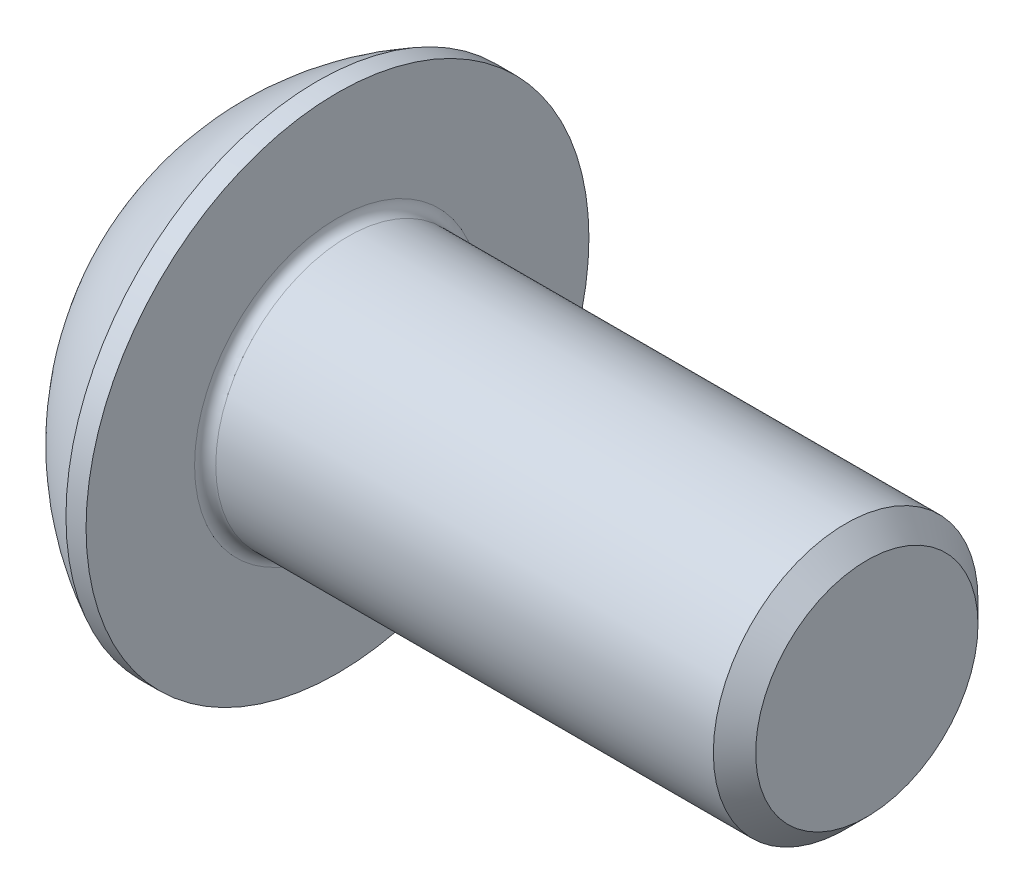
ISO-10303-21;
HEADER;
FILE_DESCRIPTION(('STEP AP214'),'2;1');
FILE_NAME('part.step','',(''),(''),'','','');
FILE_SCHEMA(('AUTOMOTIVE_DESIGN { 1 0 10303 214 1 1 1 1 }'));
ENDSEC;
DATA;
#1=APPLICATION_CONTEXT('core data for automotive mechanical design processes');
#2=APPLICATION_PROTOCOL_DEFINITION('international standard','automotive_design',2000,#1);
#3=PRODUCT_CONTEXT('',#1,'mechanical');
#4=PRODUCT('Part','Part','',(#3));
#5=PRODUCT_RELATED_PRODUCT_CATEGORY('part','',(#4));
#6=PRODUCT_DEFINITION_FORMATION('','',#4);
#7=PRODUCT_DEFINITION_CONTEXT('part definition',#1,'design');
#8=PRODUCT_DEFINITION('design','',#6,#7);
#9=PRODUCT_DEFINITION_SHAPE('','',#8);
#10=(LENGTH_UNIT() NAMED_UNIT(*) SI_UNIT(.MILLI.,.METRE.));
#11=(NAMED_UNIT(*) PLANE_ANGLE_UNIT() SI_UNIT($,.RADIAN.));
#12=(NAMED_UNIT(*) SI_UNIT($,.STERADIAN.) SOLID_ANGLE_UNIT());
#13=UNCERTAINTY_MEASURE_WITH_UNIT(LENGTH_MEASURE(1.E-05),#10,'distance_accuracy_value','');
#14=(GEOMETRIC_REPRESENTATION_CONTEXT(3) GLOBAL_UNCERTAINTY_ASSIGNED_CONTEXT((#13)) GLOBAL_UNIT_ASSIGNED_CONTEXT((#10,
#11,#12)) REPRESENTATION_CONTEXT('',''));
#15=CARTESIAN_POINT('',(0.,0.,0.));
#16=DIRECTION('',(0.,0.,1.));
#17=DIRECTION('',(1.,0.,0.));
#18=AXIS2_PLACEMENT_3D('',#15,#16,#17);
#19=CARTESIAN_POINT('',(0.,0.,0.));
#20=DIRECTION('',(-1.,0.,0.));
#21=DIRECTION('',(0.,0.,1.));
#22=AXIS2_PLACEMENT_3D('',#19,#20,#21);
#23=PLANE('',#22);
#24=CARTESIAN_POINT('',(0.,0.,0.));
#25=DIRECTION('',(-1.,0.,0.));
#26=DIRECTION('',(0.,0.,1.));
#27=AXIS2_PLACEMENT_3D('',#24,#25,#26);
#28=CIRCLE('',#27,2.375);
#29=CARTESIAN_POINT('',(0.,2.375,0.));
#30=VERTEX_POINT('',#29);
#31=EDGE_CURVE('E164',#30,#30,#28,.T.);
#32=ORIENTED_EDGE('',*,*,#31,.T.);
#33=EDGE_LOOP('',(#32));
#34=FACE_BOUND('',#33,.T.);
#35=DIRECTION('',(0.,-1.,0.));
#36=VECTOR('',#35,1.);
#37=CARTESIAN_POINT('',(0.,-0.866025403784443,1.49999999999995));
#38=LINE('',#37,#36);
#39=CARTESIAN_POINT('',(0.,0.866025403784443,1.49999999999995));
#40=VERTEX_POINT('',#39);
#41=CARTESIAN_POINT('',(0.,-0.866025403784443,1.49999999999995));
#42=VERTEX_POINT('',#41);
#43=EDGE_CURVE('E65',#40,#42,#38,.T.);
#44=ORIENTED_EDGE('',*,*,#43,.T.);
#45=DIRECTION('',(0.,-0.500000000000002,-0.866025403784442));
#46=VECTOR('',#45,1.);
#47=CARTESIAN_POINT('',(0.,-1.73205080756889,0.));
#48=LINE('',#47,#46);
#49=CARTESIAN_POINT('',(0.,-1.73205080756889,0.));
#50=VERTEX_POINT('',#49);
#51=EDGE_CURVE('E305',#42,#50,#48,.T.);
#52=ORIENTED_EDGE('',*,*,#51,.T.);
#53=DIRECTION('',(0.,0.500000000000002,-0.866025403784442));
#54=VECTOR('',#53,1.);
#55=CARTESIAN_POINT('',(0.,-0.866025403784443,-1.49999999999995));
#56=LINE('',#55,#54);
#57=CARTESIAN_POINT('',(0.,-0.866025403784443,-1.49999999999995));
#58=VERTEX_POINT('',#57);
#59=EDGE_CURVE('E145',#50,#58,#56,.T.);
#60=ORIENTED_EDGE('',*,*,#59,.T.);
#61=DIRECTION('',(0.,1.,0.));
#62=VECTOR('',#61,1.);
#63=CARTESIAN_POINT('',(0.,0.866025403784443,-1.49999999999995));
#64=LINE('',#63,#62);
#65=CARTESIAN_POINT('',(0.,0.866025403784443,-1.49999999999995));
#66=VERTEX_POINT('',#65);
#67=EDGE_CURVE('E308',#58,#66,#64,.T.);
#68=ORIENTED_EDGE('',*,*,#67,.T.);
#69=DIRECTION('',(0.,0.500000000000002,0.866025403784442));
#70=VECTOR('',#69,1.);
#71=CARTESIAN_POINT('',(0.,1.73205080756889,0.));
#72=LINE('',#71,#70);
#73=CARTESIAN_POINT('',(0.,1.73205080756889,0.));
#74=VERTEX_POINT('',#73);
#75=EDGE_CURVE('E310',#66,#74,#72,.T.);
#76=ORIENTED_EDGE('',*,*,#75,.T.);
#77=DIRECTION('',(0.,-0.500000000000002,0.866025403784442));
#78=VECTOR('',#77,1.);
#79=CARTESIAN_POINT('',(0.,0.866025403784443,1.49999999999995));
#80=LINE('',#79,#78);
#81=EDGE_CURVE('E312',#74,#40,#80,.T.);
#82=ORIENTED_EDGE('',*,*,#81,.T.);
#83=EDGE_LOOP('',(#44,#52,#60,#68,#76,#82));
#84=FACE_BOUND('',#83,.T.);
#85=ADVANCED_FACE('F49',(#34,#84),#23,.T.);
#86=CARTESIAN_POINT('',(4.75501582278481,0.,0.));
#87=DIRECTION('',(-1.,0.,0.));
#88=DIRECTION('',(0.,1.,0.));
#89=AXIS2_PLACEMENT_3D('',#86,#87,#88);
#90=SPHERICAL_SURFACE('',#89,5.31514820818139);
#91=CARTESIAN_POINT('',(2.37,0.,0.));
#92=DIRECTION('',(-1.,0.,0.));
#93=DIRECTION('',(0.,0.,1.));
#94=AXIS2_PLACEMENT_3D('',#91,#92,#93);
#95=CIRCLE('',#94,4.75);
#96=CARTESIAN_POINT('',(2.37,4.75000000000001,0.));
#97=VERTEX_POINT('',#96);
#98=EDGE_CURVE('E161',#97,#97,#95,.T.);
#99=CARTESIAN_POINT('',(2.37,4.75000000000001,0.));
#100=CARTESIAN_POINT('',(2.33822259048669,4.73404434732512,0.));
#101=CARTESIAN_POINT('',(2.30660534291523,4.71776971995818,0.));
#102=CARTESIAN_POINT('',(2.24370380094997,4.6845892715834,0.));
#103=CARTESIAN_POINT('',(2.21241950655618,4.66768345057555,0.));
#104=CARTESIAN_POINT('',(2.15019650024021,4.63324737066211,0.));
#105=CARTESIAN_POINT('',(2.11925778831804,4.61571711175651,0.));
#106=CARTESIAN_POINT('',(2.05773840110808,4.58003923142986,0.));
#107=CARTESIAN_POINT('',(2.02715772582028,4.5618916100088,0.));
#108=CARTESIAN_POINT('',(1.96636673145741,4.52498631044658,0.));
#109=CARTESIAN_POINT('',(1.93615641238234,4.50622863230543,0.));
#110=CARTESIAN_POINT('',(1.87611829826807,4.46811077571319,0.));
#111=CARTESIAN_POINT('',(1.84629050322888,4.44875059726211,0.));
#112=CARTESIAN_POINT('',(1.78702945162455,4.40943553782985,0.));
#113=CARTESIAN_POINT('',(1.75759619505941,4.38948065684866,0.));
#114=CARTESIAN_POINT('',(1.69913607574061,4.34898423002649,0.));
#115=CARTESIAN_POINT('',(1.67010921298694,4.32844268418549,0.));
#116=CARTESIAN_POINT('',(1.61247357298735,4.28678120152176,0.));
#117=CARTESIAN_POINT('',(1.58386479574143,4.26566126469901,0.));
#118=CARTESIAN_POINT('',(1.52707685004032,4.22285150694425,0.));
#119=CARTESIAN_POINT('',(1.49889768158512,4.20116168601224,0.));
#120=CARTESIAN_POINT('',(1.44298030371049,4.15722089644742,0.));
#121=CARTESIAN_POINT('',(1.41524209429107,4.13496992781462,0.));
#122=CARTESIAN_POINT('',(1.36021780711889,4.08991580528236,0.));
#123=CARTESIAN_POINT('',(1.33293172936613,4.06711265138289,0.));
#124=CARTESIAN_POINT('',(1.278822696045,4.02096334316478,0.));
#125=CARTESIAN_POINT('',(1.25199974047662,3.99761718884615,0.));
#126=CARTESIAN_POINT('',(1.19882775550162,3.95039128335164,0.));
#127=CARTESIAN_POINT('',(1.172478726095,3.92651153217577,0.));
#128=CARTESIAN_POINT('',(1.1202652065289,3.87822805145536,0.));
#129=CARTESIAN_POINT('',(1.09440071636942,3.85382432191082,0.));
#130=CARTESIAN_POINT('',(1.04316669321617,3.8045027139941,0.));
#131=CARTESIAN_POINT('',(1.01779716022241,3.77958483562193,0.));
#132=CARTESIAN_POINT('',(0.9675632699561,3.72924496668417,0.));
#133=CARTESIAN_POINT('',(0.942698912683562,3.70382297611859,0.));
#134=CARTESIAN_POINT('',(0.89348538893628,3.65248512247887,0.));
#135=CARTESIAN_POINT('',(0.869136222461535,3.62656925940473,0.));
#136=CARTESIAN_POINT('',(0.820962887873489,3.57425409935885,0.));
#137=CARTESIAN_POINT('',(0.797138719760188,3.54785480238712,0.));
#138=CARTESIAN_POINT('',(0.750024977995378,3.49458340787865,0.));
#139=CARTESIAN_POINT('',(0.726735404343869,3.46771131034192,0.));
#140=CARTESIAN_POINT('',(0.680700232274541,3.41350513847464,0.));
#141=CARTESIAN_POINT('',(0.657954633856721,3.3861710641441,0.));
#142=CARTESIAN_POINT('',(0.613016573919583,3.33105194853939,0.));
#143=CARTESIAN_POINT('',(0.590824112400264,3.30326690726522,0.));
#144=CARTESIAN_POINT('',(0.547001265128255,3.24725704926749,0.));
#145=CARTESIAN_POINT('',(0.525370879375565,3.21903223254391,0.));
#146=CARTESIAN_POINT('',(0.48268089610549,3.16215419227902,0.));
#147=CARTESIAN_POINT('',(0.461621298588105,3.1335009687377,0.));
#148=CARTESIAN_POINT('',(0.420081374357154,3.07577765602273,0.));
#149=CARTESIAN_POINT('',(0.399601047643588,3.04670756684908,0.));
#150=CARTESIAN_POINT('',(0.359227914239948,2.98816223197683,0.));
#151=CARTESIAN_POINT('',(0.339335107549872,2.95868698627822,0.));
#152=CARTESIAN_POINT('',(0.300145026860787,2.89934321060632,0.));
#153=CARTESIAN_POINT('',(0.280847752861776,2.86947468063304,0.));
#154=CARTESIAN_POINT('',(0.24285650999714,2.80935636725696,0.));
#155=CARTESIAN_POINT('',(0.224162541131515,2.77910658385417,0.));
#156=CARTESIAN_POINT('',(0.187385439283607,2.71823794734018,0.));
#157=CARTESIAN_POINT('',(0.169302306301325,2.68761909422898,0.));
#158=CARTESIAN_POINT('',(0.133754156035989,2.626024653246,0.));
#159=CARTESIAN_POINT('',(0.116289138752934,2.59504906537422,0.));
#160=CARTESIAN_POINT('',(0.0819842690057421,2.53275362391635,0.));
#161=CARTESIAN_POINT('',(0.0651444165416046,2.50143377033028,0.));
#162=CARTESIAN_POINT('',(0.0320966055444313,2.43846244094735,0.));
#163=CARTESIAN_POINT('',(0.0158886470113954,2.40681096515049,0.));
#164=CARTESIAN_POINT('',(0.,2.375,0.));
#165=B_SPLINE_CURVE_WITH_KNOTS('',3,(#99,#100,#101,#102,#103,#104,#105,#106,#107,#108,#109,#110,
#111,#112,#113,#114,#115,#116,#117,#118,#119,#120,#121,#122,#123,#124,#125,#126,#127,#128,#129,
#130,#131,#132,#133,#134,#135,#136,#137,#138,#139,#140,#141,#142,#143,#144,#145,#146,#147,#148,
#149,#150,#151,#152,#153,#154,#155,#156,#157,#158,#159,#160,#161,#162,#163,#164),.UNSPECIFIED.,
.F.,.F.,(4,2,2,2,2,2,2,2,2,2,2,2,2,2,2,2,2,2,2,2,2,2,2,2,2,2,2,2,2,2,2,2,4),(0.,
0.106672849678272,0.213345699356545,0.320018549034818,0.42669139871309,0.533364248391363,
0.640037098069635,0.746709947747908,0.853382797426182,0.960055647104454,1.06672849678273,
1.173401346461,1.28007419613927,1.38674704581754,1.49341989549582,1.60009274517409,
1.70676559485236,1.81343844453064,1.92011129420891,2.02678414388718,2.13345699356545,
2.24012984324373,2.346802692922,2.45347554260027,2.56014839227854,2.66682124195682,
2.77349409163509,2.88016694131336,2.98683979099164,3.09351264066991,3.20018549034818,
3.30685834002646,3.41353118970473),.UNSPECIFIED.);
#166=EDGE_CURVE('BSEAM186',#97,#30,#165,.T.);
#167=ORIENTED_EDGE('',*,*,#98,.T.);
#168=ORIENTED_EDGE('',*,*,#31,.F.);
#169=ORIENTED_EDGE('',*,*,#166,.T.);
#170=ORIENTED_EDGE('',*,*,#166,.F.);
#171=EDGE_LOOP('',(#167,#169,#168,#170));
#172=FACE_BOUND('',#171,.T.);
#173=ADVANCED_FACE('F186',(#172),#90,.T.);
#174=CARTESIAN_POINT('',(0.,0.,0.));
#175=DIRECTION('',(-1.,0.,0.));
#176=DIRECTION('',(0.,0.,1.));
#177=AXIS2_PLACEMENT_3D('',#174,#175,#176);
#178=CYLINDRICAL_SURFACE('',#177,4.75);
#179=ORIENTED_EDGE('',*,*,#98,.F.);
#180=EDGE_LOOP('',(#179));
#181=FACE_BOUND('',#180,.T.);
#182=CARTESIAN_POINT('',(2.75,0.,0.));
#183=DIRECTION('',(-1.,0.,0.));
#184=DIRECTION('',(0.,0.,1.));
#185=AXIS2_PLACEMENT_3D('',#182,#183,#184);
#186=CIRCLE('',#185,4.75);
#187=CARTESIAN_POINT('',(2.75,0.,4.75000000000002));
#188=VERTEX_POINT('',#187);
#189=EDGE_CURVE('E157',#188,#188,#186,.T.);
#190=ORIENTED_EDGE('',*,*,#189,.T.);
#191=EDGE_LOOP('',(#190));
#192=FACE_BOUND('',#191,.T.);
#193=ADVANCED_FACE('F194',(#181,#192),#178,.T.);
#194=CARTESIAN_POINT('',(2.75,2.5,0.));
#195=DIRECTION('',(-1.,0.,0.));
#196=DIRECTION('',(0.,0.,1.));
#197=AXIS2_PLACEMENT_3D('',#194,#195,#196);
#198=PLANE('',#197);
#199=CARTESIAN_POINT('',(2.75,0.,0.));
#200=DIRECTION('',(-1.,0.,0.));
#201=DIRECTION('',(0.,0.,1.));
#202=AXIS2_PLACEMENT_3D('',#199,#200,#201);
#203=CIRCLE('',#202,2.7);
#204=CARTESIAN_POINT('',(2.75,0.,2.70000000000001));
#205=VERTEX_POINT('',#204);
#206=EDGE_CURVE('E167',#205,#205,#203,.T.);
#207=ORIENTED_EDGE('',*,*,#206,.T.);
#208=EDGE_LOOP('',(#207));
#209=FACE_BOUND('',#208,.T.);
#210=ORIENTED_EDGE('',*,*,#189,.F.);
#211=EDGE_LOOP('',(#210));
#212=FACE_BOUND('',#211,.T.);
#213=ADVANCED_FACE('F207',(#209,#212),#198,.F.);
#214=CARTESIAN_POINT('',(0.,0.,0.));
#215=DIRECTION('',(-1.,0.,0.));
#216=DIRECTION('',(0.,0.,1.));
#217=AXIS2_PLACEMENT_3D('',#214,#215,#216);
#218=CYLINDRICAL_SURFACE('',#217,2.5);
#219=CARTESIAN_POINT('',(12.35,0.,0.));
#220=DIRECTION('',(1.,0.,0.));
#221=DIRECTION('',(0.,0.,-1.));
#222=AXIS2_PLACEMENT_3D('',#219,#220,#221);
#223=CIRCLE('',#222,2.5);
#224=CARTESIAN_POINT('',(12.35,0.,-2.5));
#225=VERTEX_POINT('',#224);
#226=EDGE_CURVE('E13',#225,#225,#223,.F.);
#227=ORIENTED_EDGE('',*,*,#226,.T.);
#228=EDGE_LOOP('',(#227));
#229=FACE_BOUND('',#228,.T.);
#230=CARTESIAN_POINT('',(2.95,0.,0.));
#231=DIRECTION('',(-1.,0.,0.));
#232=DIRECTION('',(0.,0.,1.));
#233=AXIS2_PLACEMENT_3D('',#230,#231,#232);
#234=CIRCLE('',#233,2.5);
#235=CARTESIAN_POINT('',(2.95,0.,2.50000000000001));
#236=VERTEX_POINT('',#235);
#237=EDGE_CURVE('E170',#236,#236,#234,.F.);
#238=ORIENTED_EDGE('',*,*,#237,.T.);
#239=EDGE_LOOP('',(#238));
#240=FACE_BOUND('',#239,.T.);
#241=ADVANCED_FACE('F200',(#229,#240),#218,.T.);
#242=CARTESIAN_POINT('',(2.95,0.,0.));
#243=DIRECTION('',(-1.,0.,0.));
#244=DIRECTION('',(0.,0.,1.));
#245=AXIS2_PLACEMENT_3D('',#242,#243,#244);
#246=TOROIDAL_SURFACE('',#245,2.7,0.2);
#247=ORIENTED_EDGE('',*,*,#237,.F.);
#248=EDGE_LOOP('',(#247));
#249=FACE_BOUND('',#248,.T.);
#250=ORIENTED_EDGE('',*,*,#206,.F.);
#251=EDGE_LOOP('',(#250));
#252=FACE_BOUND('',#251,.T.);
#253=ADVANCED_FACE('F198',(#249,#252),#246,.F.);
#254=CARTESIAN_POINT('',(1.56,-1.73205080756889,0.));
#255=DIRECTION('',(0.,0.866025403784442,-0.500000000000002));
#256=DIRECTION('',(0.,0.500000000000002,0.866025403784442));
#257=AXIS2_PLACEMENT_3D('',#254,#255,#256);
#258=PLANE('',#257);
#259=DIRECTION('',(0.,-0.500000000000002,-0.866025403784442));
#260=VECTOR('',#259,1.);
#261=CARTESIAN_POINT('',(1.56,-1.73205080756889,0.));
#262=LINE('',#261,#260);
#263=CARTESIAN_POINT('',(1.56,-0.866025403784443,1.49999999999995));
#264=VERTEX_POINT('',#263);
#265=CARTESIAN_POINT('',(1.56,-1.29903810567666,0.750000000000028));
#266=VERTEX_POINT('',#265);
#267=EDGE_CURVE('E131',#264,#266,#262,.T.);
#268=ORIENTED_EDGE('',*,*,#267,.T.);
#269=CARTESIAN_POINT('',(1.56,-1.73205080756889,0.));
#270=VERTEX_POINT('',#269);
#271=EDGE_CURVE('E126',#266,#270,#262,.T.);
#272=ORIENTED_EDGE('',*,*,#271,.T.);
#273=DIRECTION('',(-1.,0.,0.));
#274=VECTOR('',#273,1.);
#275=CARTESIAN_POINT('',(1.56,-1.73205080756889,0.));
#276=LINE('',#275,#274);
#277=EDGE_CURVE('E128',#270,#50,#276,.T.);
#278=ORIENTED_EDGE('',*,*,#277,.T.);
#279=ORIENTED_EDGE('',*,*,#51,.F.);
#280=DIRECTION('',(-1.,0.,0.));
#281=VECTOR('',#280,1.);
#282=CARTESIAN_POINT('',(1.56,-0.866025403784443,1.49999999999995));
#283=LINE('',#282,#281);
#284=EDGE_CURVE('E301',#264,#42,#283,.T.);
#285=ORIENTED_EDGE('',*,*,#284,.F.);
#286=EDGE_LOOP('',(#268,#272,#278,#279,#285));
#287=FACE_BOUND('',#286,.T.);
#288=ADVANCED_FACE('F127',(#287),#258,.T.);
#289=CARTESIAN_POINT('',(1.56,-0.866025403784443,-1.49999999999995));
#290=DIRECTION('',(0.,0.866025403784442,0.500000000000002));
#291=DIRECTION('',(0.,-0.500000000000002,0.866025403784442));
#292=AXIS2_PLACEMENT_3D('',#289,#290,#291);
#293=PLANE('',#292);
#294=DIRECTION('',(0.,0.500000000000002,-0.866025403784442));
#295=VECTOR('',#294,1.);
#296=CARTESIAN_POINT('',(1.56,-0.866025403784443,-1.49999999999995));
#297=LINE('',#296,#295);
#298=CARTESIAN_POINT('',(1.56,-1.29903810567666,-0.750000000000028));
#299=VERTEX_POINT('',#298);
#300=EDGE_CURVE('E73',#270,#299,#297,.T.);
#301=ORIENTED_EDGE('',*,*,#300,.T.);
#302=CARTESIAN_POINT('',(1.56,-0.866025403784443,-1.49999999999995));
#303=VERTEX_POINT('',#302);
#304=EDGE_CURVE('E140',#299,#303,#297,.T.);
#305=ORIENTED_EDGE('',*,*,#304,.T.);
#306=DIRECTION('',(-1.,0.,0.));
#307=VECTOR('',#306,1.);
#308=CARTESIAN_POINT('',(1.56,-0.866025403784443,-1.49999999999995));
#309=LINE('',#308,#307);
#310=EDGE_CURVE('E147',#303,#58,#309,.T.);
#311=ORIENTED_EDGE('',*,*,#310,.T.);
#312=ORIENTED_EDGE('',*,*,#59,.F.);
#313=ORIENTED_EDGE('',*,*,#277,.F.);
#314=EDGE_LOOP('',(#301,#305,#311,#312,#313));
#315=FACE_BOUND('',#314,.T.);
#316=ADVANCED_FACE('F143',(#315),#293,.T.);
#317=CARTESIAN_POINT('',(1.56,0.866025403784443,-1.49999999999995));
#318=DIRECTION('',(0.,0.,1.));
#319=DIRECTION('',(1.,0.,0.));
#320=AXIS2_PLACEMENT_3D('',#317,#318,#319);
#321=PLANE('',#320);
#322=DIRECTION('',(0.,1.,0.));
#323=VECTOR('',#322,1.);
#324=CARTESIAN_POINT('',(1.56,0.866025403784443,-1.49999999999995));
#325=LINE('',#324,#323);
#326=CARTESIAN_POINT('',(1.56,0.,-1.49999999999995));
#327=VERTEX_POINT('',#326);
#328=EDGE_CURVE('E282',#303,#327,#325,.T.);
#329=ORIENTED_EDGE('',*,*,#328,.T.);
#330=CARTESIAN_POINT('',(1.56,0.866025403784443,-1.49999999999995));
#331=VERTEX_POINT('',#330);
#332=EDGE_CURVE('E139',#327,#331,#325,.T.);
#333=ORIENTED_EDGE('',*,*,#332,.T.);
#334=DIRECTION('',(-1.,0.,0.));
#335=VECTOR('',#334,1.);
#336=CARTESIAN_POINT('',(1.56,0.866025403784443,-1.49999999999995));
#337=LINE('',#336,#335);
#338=EDGE_CURVE('E152',#331,#66,#337,.T.);
#339=ORIENTED_EDGE('',*,*,#338,.T.);
#340=ORIENTED_EDGE('',*,*,#67,.F.);
#341=ORIENTED_EDGE('',*,*,#310,.F.);
#342=EDGE_LOOP('',(#329,#333,#339,#340,#341));
#343=FACE_BOUND('',#342,.T.);
#344=ADVANCED_FACE('F232',(#343),#321,.T.);
#345=CARTESIAN_POINT('',(1.56,1.73205080756889,0.));
#346=DIRECTION('',(0.,-0.866025403784442,0.500000000000002));
#347=DIRECTION('',(0.,-0.500000000000002,-0.866025403784442));
#348=AXIS2_PLACEMENT_3D('',#345,#346,#347);
#349=PLANE('',#348);
#350=DIRECTION('',(0.,0.500000000000002,0.866025403784442));
#351=VECTOR('',#350,1.);
#352=CARTESIAN_POINT('',(1.56,1.73205080756889,0.));
#353=LINE('',#352,#351);
#354=CARTESIAN_POINT('',(1.56,1.29903810567666,-0.750000000000028));
#355=VERTEX_POINT('',#354);
#356=EDGE_CURVE('E271',#331,#355,#353,.T.);
#357=ORIENTED_EDGE('',*,*,#356,.T.);
#358=CARTESIAN_POINT('',(1.56,1.73205080756889,0.));
#359=VERTEX_POINT('',#358);
#360=EDGE_CURVE('E276',#355,#359,#353,.T.);
#361=ORIENTED_EDGE('',*,*,#360,.T.);
#362=DIRECTION('',(-1.,0.,0.));
#363=VECTOR('',#362,1.);
#364=CARTESIAN_POINT('',(1.56,1.73205080756889,0.));
#365=LINE('',#364,#363);
#366=EDGE_CURVE('E316',#359,#74,#365,.T.);
#367=ORIENTED_EDGE('',*,*,#366,.T.);
#368=ORIENTED_EDGE('',*,*,#75,.F.);
#369=ORIENTED_EDGE('',*,*,#338,.F.);
#370=EDGE_LOOP('',(#357,#361,#367,#368,#369));
#371=FACE_BOUND('',#370,.T.);
#372=ADVANCED_FACE('F235',(#371),#349,.T.);
#373=CARTESIAN_POINT('',(1.56,0.866025403784443,1.49999999999995));
#374=DIRECTION('',(0.,-0.866025403784442,-0.500000000000002));
#375=DIRECTION('',(0.,0.500000000000002,-0.866025403784442));
#376=AXIS2_PLACEMENT_3D('',#373,#374,#375);
#377=PLANE('',#376);
#378=DIRECTION('',(0.,-0.500000000000002,0.866025403784442));
#379=VECTOR('',#378,1.);
#380=CARTESIAN_POINT('',(1.56,0.866025403784443,1.49999999999995));
#381=LINE('',#380,#379);
#382=CARTESIAN_POINT('',(1.56,1.29903810567666,0.750000000000028));
#383=VERTEX_POINT('',#382);
#384=EDGE_CURVE('E279',#359,#383,#381,.T.);
#385=ORIENTED_EDGE('',*,*,#384,.T.);
#386=CARTESIAN_POINT('',(1.56,0.866025403784443,1.49999999999995));
#387=VERTEX_POINT('',#386);
#388=EDGE_CURVE('E287',#383,#387,#381,.T.);
#389=ORIENTED_EDGE('',*,*,#388,.T.);
#390=DIRECTION('',(-1.,0.,0.));
#391=VECTOR('',#390,1.);
#392=CARTESIAN_POINT('',(1.56,0.866025403784443,1.49999999999995));
#393=LINE('',#392,#391);
#394=EDGE_CURVE('E300',#387,#40,#393,.T.);
#395=ORIENTED_EDGE('',*,*,#394,.T.);
#396=ORIENTED_EDGE('',*,*,#81,.F.);
#397=ORIENTED_EDGE('',*,*,#366,.F.);
#398=EDGE_LOOP('',(#385,#389,#395,#396,#397));
#399=FACE_BOUND('',#398,.T.);
#400=ADVANCED_FACE('F239',(#399),#377,.T.);
#401=CARTESIAN_POINT('',(1.56,-0.866025403784443,1.49999999999995));
#402=DIRECTION('',(0.,0.,-1.));
#403=DIRECTION('',(-1.,0.,0.));
#404=AXIS2_PLACEMENT_3D('',#401,#402,#403);
#405=PLANE('',#404);
#406=DIRECTION('',(0.,-1.,0.));
#407=VECTOR('',#406,1.);
#408=CARTESIAN_POINT('',(1.56,-0.866025403784443,1.49999999999995));
#409=LINE('',#408,#407);
#410=CARTESIAN_POINT('',(1.56,0.,1.49999999999995));
#411=VERTEX_POINT('',#410);
#412=EDGE_CURVE('E293',#387,#411,#409,.T.);
#413=ORIENTED_EDGE('',*,*,#412,.T.);
#414=EDGE_CURVE('E295',#411,#264,#409,.T.);
#415=ORIENTED_EDGE('',*,*,#414,.T.);
#416=ORIENTED_EDGE('',*,*,#284,.T.);
#417=ORIENTED_EDGE('',*,*,#43,.F.);
#418=ORIENTED_EDGE('',*,*,#394,.F.);
#419=EDGE_LOOP('',(#413,#415,#416,#417,#418));
#420=FACE_BOUND('',#419,.T.);
#421=ADVANCED_FACE('F243',(#420),#405,.T.);
#422=CARTESIAN_POINT('',(1.56,-1.73205080756889,0.));
#423=DIRECTION('',(1.,0.,0.));
#424=DIRECTION('',(0.,0.,-1.));
#425=AXIS2_PLACEMENT_3D('',#422,#423,#424);
#426=PLANE('',#425);
#427=CARTESIAN_POINT('',(1.56,0.,0.));
#428=DIRECTION('',(-1.,0.,0.));
#429=DIRECTION('',(0.,0.,1.));
#430=AXIS2_PLACEMENT_3D('',#427,#428,#429);
#431=CIRCLE('',#430,1.5);
#432=EDGE_CURVE('E268',#355,#327,#431,.T.);
#433=ORIENTED_EDGE('',*,*,#432,.F.);
#434=ORIENTED_EDGE('',*,*,#356,.F.);
#435=ORIENTED_EDGE('',*,*,#332,.F.);
#436=EDGE_LOOP('',(#433,#434,#435));
#437=FACE_BOUND('',#436,.T.);
#438=ADVANCED_FACE('F247',(#437),#426,.F.);
#439=EDGE_CURVE('E158',#383,#355,#431,.T.);
#440=ORIENTED_EDGE('',*,*,#439,.F.);
#441=ORIENTED_EDGE('',*,*,#384,.F.);
#442=ORIENTED_EDGE('',*,*,#360,.F.);
#443=EDGE_LOOP('',(#440,#441,#442));
#444=FACE_BOUND('',#443,.T.);
#445=ADVANCED_FACE('F257',(#444),#426,.F.);
#446=EDGE_CURVE('E151',#411,#383,#431,.T.);
#447=ORIENTED_EDGE('',*,*,#446,.F.);
#448=ORIENTED_EDGE('',*,*,#412,.F.);
#449=ORIENTED_EDGE('',*,*,#388,.F.);
#450=EDGE_LOOP('',(#447,#448,#449));
#451=FACE_BOUND('',#450,.T.);
#452=ADVANCED_FACE('F263',(#451),#426,.F.);
#453=EDGE_CURVE('E146',#266,#411,#431,.T.);
#454=ORIENTED_EDGE('',*,*,#453,.F.);
#455=ORIENTED_EDGE('',*,*,#267,.F.);
#456=ORIENTED_EDGE('',*,*,#414,.F.);
#457=EDGE_LOOP('',(#454,#455,#456));
#458=FACE_BOUND('',#457,.T.);
#459=ADVANCED_FACE('F255',(#458),#426,.F.);
#460=EDGE_CURVE('E137',#299,#266,#431,.T.);
#461=ORIENTED_EDGE('',*,*,#460,.F.);
#462=ORIENTED_EDGE('',*,*,#300,.F.);
#463=ORIENTED_EDGE('',*,*,#271,.F.);
#464=EDGE_LOOP('',(#461,#462,#463));
#465=FACE_BOUND('',#464,.T.);
#466=ADVANCED_FACE('F136',(#465),#426,.F.);
#467=EDGE_CURVE('E274',#327,#299,#431,.T.);
#468=ORIENTED_EDGE('',*,*,#467,.F.);
#469=ORIENTED_EDGE('',*,*,#328,.F.);
#470=ORIENTED_EDGE('',*,*,#304,.F.);
#471=EDGE_LOOP('',(#468,#469,#470));
#472=FACE_BOUND('',#471,.T.);
#473=ADVANCED_FACE('F227',(#472),#426,.F.);
#474=CARTESIAN_POINT('',(2.42602540378445,0.,0.));
#475=DIRECTION('',(-1.,0.,0.));
#476=DIRECTION('',(0.,0.,1.));
#477=AXIS2_PLACEMENT_3D('',#474,#475,#476);
#478=CONICAL_SURFACE('',#477,0.,1.0471975511966);
#479=ORIENTED_EDGE('',*,*,#446,.T.);
#480=ORIENTED_EDGE('',*,*,#439,.T.);
#481=ORIENTED_EDGE('',*,*,#432,.T.);
#482=ORIENTED_EDGE('',*,*,#467,.T.);
#483=ORIENTED_EDGE('',*,*,#460,.T.);
#484=ORIENTED_EDGE('',*,*,#453,.T.);
#485=EDGE_LOOP('',(#479,#480,#481,#482,#483,#484));
#486=FACE_BOUND('',#485,.T.);
#487=CARTESIAN_POINT('',(2.42602540378445,0.,0.));
#488=VERTEX_POINT('',#487);
#489=VERTEX_LOOP('',#488);
#490=FACE_BOUND('',#489,.T.);
#491=ADVANCED_FACE('F182',(#486,#490),#478,.F.);
#492=CARTESIAN_POINT('',(12.75,0.,0.));
#493=DIRECTION('',(1.,0.,0.));
#494=DIRECTION('',(0.,0.,-1.));
#495=AXIS2_PLACEMENT_3D('',#492,#493,#494);
#496=PLANE('',#495);
#497=CARTESIAN_POINT('',(12.75,0.,0.));
#498=DIRECTION('',(1.,0.,0.));
#499=DIRECTION('',(0.,0.,-1.));
#500=AXIS2_PLACEMENT_3D('',#497,#498,#499);
#501=CIRCLE('',#500,2.10000000000001);
#502=CARTESIAN_POINT('',(12.75,0.,-2.10000000000001));
#503=VERTEX_POINT('',#502);
#504=EDGE_CURVE('E58',#503,#503,#501,.T.);
#505=ORIENTED_EDGE('',*,*,#504,.T.);
#506=EDGE_LOOP('',(#505));
#507=FACE_BOUND('',#506,.T.);
#508=ADVANCED_FACE('F175',(#507),#496,.T.);
#509=CARTESIAN_POINT('',(12.75,0.,0.));
#510=DIRECTION('',(-1.,0.,0.));
#511=DIRECTION('',(0.,0.,1.));
#512=AXIS2_PLACEMENT_3D('',#509,#510,#511);
#513=CONICAL_SURFACE('',#512,2.10000000000001,0.785398163397448);
#514=ORIENTED_EDGE('',*,*,#226,.F.);
#515=EDGE_LOOP('',(#514));
#516=FACE_BOUND('',#515,.T.);
#517=ORIENTED_EDGE('',*,*,#504,.F.);
#518=EDGE_LOOP('',(#517));
#519=FACE_BOUND('',#518,.T.);
#520=ADVANCED_FACE('F52',(#516,#519),#513,.T.);
#521=CLOSED_SHELL('',(#85,#173,#193,#213,#241,#253,#288,#316,#344,#372,#400,#421,#438,#445,#452,
#459,#466,#473,#491,#508,#520));
#522=MANIFOLD_SOLID_BREP('B2',#521);
#523=ADVANCED_BREP_SHAPE_REPRESENTATION('',(#18,#522),#14);
#524=SHAPE_DEFINITION_REPRESENTATION(#9,#523);
ENDSEC;
END-ISO-10303-21;
